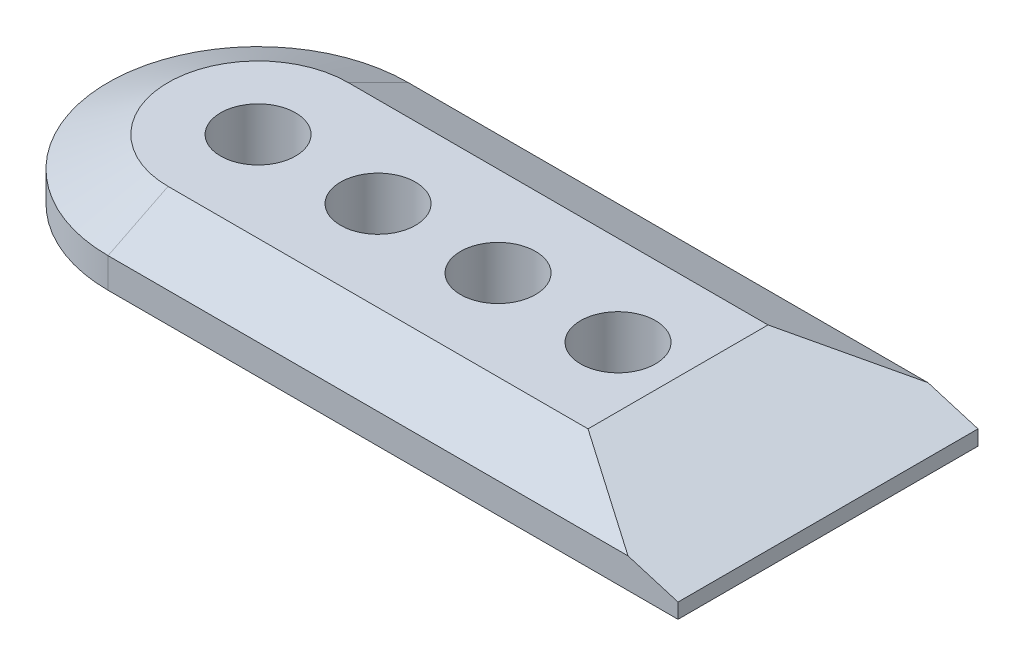
ISO-10303-21;
HEADER;
FILE_DESCRIPTION(('STEP AP214'),'2;1');
FILE_NAME('part.step','',(''),(''),'','','');
FILE_SCHEMA(('AUTOMOTIVE_DESIGN { 1 0 10303 214 1 1 1 1 }'));
ENDSEC;
DATA;
#1=APPLICATION_CONTEXT('core data for automotive mechanical design processes');
#2=APPLICATION_PROTOCOL_DEFINITION('international standard','automotive_design',2000,#1);
#3=PRODUCT_CONTEXT('',#1,'mechanical');
#4=PRODUCT('Part','Part','',(#3));
#5=PRODUCT_RELATED_PRODUCT_CATEGORY('part','',(#4));
#6=PRODUCT_DEFINITION_FORMATION('','',#4);
#7=PRODUCT_DEFINITION_CONTEXT('part definition',#1,'design');
#8=PRODUCT_DEFINITION('design','',#6,#7);
#9=PRODUCT_DEFINITION_SHAPE('','',#8);
#10=(LENGTH_UNIT() NAMED_UNIT(*) SI_UNIT(.MILLI.,.METRE.));
#11=(NAMED_UNIT(*) PLANE_ANGLE_UNIT() SI_UNIT($,.RADIAN.));
#12=(NAMED_UNIT(*) SI_UNIT($,.STERADIAN.) SOLID_ANGLE_UNIT());
#13=UNCERTAINTY_MEASURE_WITH_UNIT(LENGTH_MEASURE(1.E-05),#10,'distance_accuracy_value','');
#14=(GEOMETRIC_REPRESENTATION_CONTEXT(3) GLOBAL_UNCERTAINTY_ASSIGNED_CONTEXT((#13)) GLOBAL_UNIT_ASSIGNED_CONTEXT((#10,
#11,#12)) REPRESENTATION_CONTEXT('',''));
#15=CARTESIAN_POINT('',(0.,0.,0.));
#16=DIRECTION('',(0.,0.,1.));
#17=DIRECTION('',(1.,0.,0.));
#18=AXIS2_PLACEMENT_3D('',#15,#16,#17);
#19=CARTESIAN_POINT('',(0.,12.7,0.));
#20=DIRECTION('',(0.,-1.,0.));
#21=DIRECTION('',(0.,0.,-1.));
#22=AXIS2_PLACEMENT_3D('',#19,#20,#21);
#23=CYLINDRICAL_SURFACE('',#22,31.7500000000001);
#24=DIRECTION('',(0.,-1.,0.));
#25=VECTOR('',#24,1.);
#26=CARTESIAN_POINT('',(4.34453754557068E-06,12.7,31.75));
#27=LINE('',#26,#25);
#28=CARTESIAN_POINT('',(4.34453754557068E-06,6.34999999999999,31.75));
#29=VERTEX_POINT('',#28);
#30=CARTESIAN_POINT('',(4.34453754557068E-06,0.,31.75));
#31=VERTEX_POINT('',#30);
#32=EDGE_CURVE('E100',#29,#31,#27,.T.);
#33=ORIENTED_EDGE('',*,*,#32,.F.);
#34=CARTESIAN_POINT('',(0.,6.34999999999999,0.));
#35=DIRECTION('',(0.,-1.,0.));
#36=DIRECTION('',(0.,0.,-1.));
#37=AXIS2_PLACEMENT_3D('',#34,#35,#36);
#38=CIRCLE('',#37,31.7500000000001);
#39=CARTESIAN_POINT('',(0.,6.34999999999999,-31.75));
#40=VERTEX_POINT('',#39);
#41=EDGE_CURVE('E161',#29,#40,#38,.T.);
#42=ORIENTED_EDGE('',*,*,#41,.T.);
#43=DIRECTION('',(0.,-1.,0.));
#44=VECTOR('',#43,1.);
#45=CARTESIAN_POINT('',(0.,12.7,-31.75));
#46=LINE('',#45,#44);
#47=CARTESIAN_POINT('',(0.,0.,-31.75));
#48=VERTEX_POINT('',#47);
#49=EDGE_CURVE('E123',#40,#48,#46,.T.);
#50=ORIENTED_EDGE('',*,*,#49,.T.);
#51=CARTESIAN_POINT('',(0.,0.,0.));
#52=DIRECTION('',(0.,1.,0.));
#53=DIRECTION('',(0.,0.,-1.));
#54=AXIS2_PLACEMENT_3D('',#51,#52,#53);
#55=CIRCLE('',#54,31.7500000000001);
#56=EDGE_CURVE('E117',#48,#31,#55,.T.);
#57=ORIENTED_EDGE('',*,*,#56,.T.);
#58=EDGE_LOOP('',(#33,#42,#50,#57));
#59=FACE_BOUND('',#58,.T.);
#60=ADVANCED_FACE('F41',(#59),#23,.T.);
#61=CARTESIAN_POINT('',(4.34453754557068E-06,12.7,31.75));
#62=DIRECTION('',(0.,0.,-1.));
#63=DIRECTION('',(-1.,0.,0.));
#64=AXIS2_PLACEMENT_3D('',#61,#62,#63);
#65=PLANE('',#64);
#66=DIRECTION('',(0.,-1.,0.));
#67=VECTOR('',#66,1.);
#68=CARTESIAN_POINT('',(120.650004344538,12.7,31.75));
#69=LINE('',#68,#67);
#70=CARTESIAN_POINT('',(120.650004344538,3.17499999999999,31.75));
#71=VERTEX_POINT('',#70);
#72=CARTESIAN_POINT('',(120.650004344538,0.,31.75));
#73=VERTEX_POINT('',#72);
#74=EDGE_CURVE('E111',#71,#73,#69,.T.);
#75=ORIENTED_EDGE('',*,*,#74,.F.);
#76=DIRECTION('',(0.957826285221152,-0.287347885566343,0.));
#77=VECTOR('',#76,1.);
#78=CARTESIAN_POINT('',(88.9000043445372,12.7,31.75));
#79=LINE('',#78,#77);
#80=CARTESIAN_POINT('',(110.066671011204,6.34999999999999,31.75));
#81=VERTEX_POINT('',#80);
#82=EDGE_CURVE('E51',#71,#81,#79,.F.);
#83=ORIENTED_EDGE('',*,*,#82,.T.);
#84=DIRECTION('',(-1.,0.,0.));
#85=VECTOR('',#84,1.);
#86=CARTESIAN_POINT('',(4.34453754557068E-06,6.34999999999999,31.75));
#87=LINE('',#86,#85);
#88=EDGE_CURVE('E105',#81,#29,#87,.T.);
#89=ORIENTED_EDGE('',*,*,#88,.T.);
#90=ORIENTED_EDGE('',*,*,#32,.T.);
#91=DIRECTION('',(1.,0.,0.));
#92=VECTOR('',#91,1.);
#93=CARTESIAN_POINT('',(4.34453754557068E-06,0.,31.75));
#94=LINE('',#93,#92);
#95=EDGE_CURVE('E103',#31,#73,#94,.T.);
#96=ORIENTED_EDGE('',*,*,#95,.T.);
#97=EDGE_LOOP('',(#75,#83,#89,#90,#96));
#98=FACE_BOUND('',#97,.T.);
#99=ADVANCED_FACE('F102',(#98),#65,.F.);
#100=CARTESIAN_POINT('',(120.650004344538,12.7,31.75));
#101=DIRECTION('',(-1.,0.,0.));
#102=DIRECTION('',(0.,0.,1.));
#103=AXIS2_PLACEMENT_3D('',#100,#101,#102);
#104=PLANE('',#103);
#105=DIRECTION('',(0.,-1.,0.));
#106=VECTOR('',#105,1.);
#107=CARTESIAN_POINT('',(120.650004344538,12.7,-31.75));
#108=LINE('',#107,#106);
#109=CARTESIAN_POINT('',(120.650004344538,3.17499999999999,-31.75));
#110=VERTEX_POINT('',#109);
#111=CARTESIAN_POINT('',(120.650004344538,0.,-31.75));
#112=VERTEX_POINT('',#111);
#113=EDGE_CURVE('E143',#110,#112,#108,.T.);
#114=ORIENTED_EDGE('',*,*,#113,.F.);
#115=DIRECTION('',(0.,0.,1.));
#116=VECTOR('',#115,1.);
#117=CARTESIAN_POINT('',(120.650004344538,3.17499999999999,31.75));
#118=LINE('',#117,#116);
#119=EDGE_CURVE('E65',#110,#71,#118,.T.);
#120=ORIENTED_EDGE('',*,*,#119,.T.);
#121=ORIENTED_EDGE('',*,*,#74,.T.);
#122=DIRECTION('',(0.,0.,-1.));
#123=VECTOR('',#122,1.);
#124=CARTESIAN_POINT('',(120.650004344538,0.,31.75));
#125=LINE('',#124,#123);
#126=EDGE_CURVE('E119',#73,#112,#125,.T.);
#127=ORIENTED_EDGE('',*,*,#126,.T.);
#128=EDGE_LOOP('',(#114,#120,#121,#127));
#129=FACE_BOUND('',#128,.T.);
#130=ADVANCED_FACE('F187',(#129),#104,.F.);
#131=CARTESIAN_POINT('',(120.650004344538,12.7,-31.75));
#132=DIRECTION('',(0.,0.,1.));
#133=DIRECTION('',(1.,0.,0.));
#134=AXIS2_PLACEMENT_3D('',#131,#132,#133);
#135=PLANE('',#134);
#136=DIRECTION('',(1.,0.,0.));
#137=VECTOR('',#136,1.);
#138=CARTESIAN_POINT('',(120.650004344538,6.34999999999999,-31.75));
#139=LINE('',#138,#137);
#140=CARTESIAN_POINT('',(110.066671011204,6.34999999999999,-31.75));
#141=VERTEX_POINT('',#140);
#142=EDGE_CURVE('E157',#40,#141,#139,.T.);
#143=ORIENTED_EDGE('',*,*,#142,.T.);
#144=DIRECTION('',(-0.957826285221152,0.287347885566343,0.));
#145=VECTOR('',#144,1.);
#146=CARTESIAN_POINT('',(88.9000043445372,12.7,-31.75));
#147=LINE('',#146,#145);
#148=EDGE_CURVE('E177',#141,#110,#147,.F.);
#149=ORIENTED_EDGE('',*,*,#148,.T.);
#150=ORIENTED_EDGE('',*,*,#113,.T.);
#151=DIRECTION('',(-1.,0.,0.));
#152=VECTOR('',#151,1.);
#153=CARTESIAN_POINT('',(120.650004344538,0.,-31.75));
#154=LINE('',#153,#152);
#155=EDGE_CURVE('E138',#112,#48,#154,.T.);
#156=ORIENTED_EDGE('',*,*,#155,.T.);
#157=ORIENTED_EDGE('',*,*,#49,.F.);
#158=EDGE_LOOP('',(#143,#149,#150,#156,#157));
#159=FACE_BOUND('',#158,.T.);
#160=ADVANCED_FACE('F184',(#159),#135,.F.);
#161=CARTESIAN_POINT('',(0.,12.7,0.));
#162=DIRECTION('',(0.,-1.,0.));
#163=DIRECTION('',(0.,0.,-1.));
#164=AXIS2_PLACEMENT_3D('',#161,#162,#163);
#165=PLANE('',#164);
#166=CARTESIAN_POINT('',(0.,12.7,0.));
#167=DIRECTION('',(0.,1.,0.));
#168=DIRECTION('',(0.,0.,1.));
#169=AXIS2_PLACEMENT_3D('',#166,#167,#168);
#170=CIRCLE('',#169,7.9375);
#171=CARTESIAN_POINT('',(0.,12.7,7.9375));
#172=VERTEX_POINT('',#171);
#173=EDGE_CURVE('E169',#172,#172,#170,.T.);
#174=ORIENTED_EDGE('',*,*,#173,.F.);
#175=EDGE_LOOP('',(#174));
#176=FACE_BOUND('',#175,.T.);
#177=CARTESIAN_POINT('',(25.4,12.7,0.));
#178=DIRECTION('',(0.,1.,0.));
#179=DIRECTION('',(0.,0.,1.));
#180=AXIS2_PLACEMENT_3D('',#177,#178,#179);
#181=CIRCLE('',#180,7.9375);
#182=CARTESIAN_POINT('',(25.4,12.7,7.9375));
#183=VERTEX_POINT('',#182);
#184=EDGE_CURVE('E252',#183,#183,#181,.T.);
#185=ORIENTED_EDGE('',*,*,#184,.F.);
#186=EDGE_LOOP('',(#185));
#187=FACE_BOUND('',#186,.T.);
#188=CARTESIAN_POINT('',(50.8,12.7,0.));
#189=DIRECTION('',(0.,1.,0.));
#190=DIRECTION('',(0.,0.,1.));
#191=AXIS2_PLACEMENT_3D('',#188,#189,#190);
#192=CIRCLE('',#191,7.9375);
#193=CARTESIAN_POINT('',(50.8,12.7,7.9375));
#194=VERTEX_POINT('',#193);
#195=EDGE_CURVE('E264',#194,#194,#192,.T.);
#196=ORIENTED_EDGE('',*,*,#195,.F.);
#197=EDGE_LOOP('',(#196));
#198=FACE_BOUND('',#197,.T.);
#199=CARTESIAN_POINT('',(76.2,12.7,0.));
#200=DIRECTION('',(0.,1.,0.));
#201=DIRECTION('',(0.,0.,1.));
#202=AXIS2_PLACEMENT_3D('',#199,#200,#201);
#203=CIRCLE('',#202,7.93749999999999);
#204=CARTESIAN_POINT('',(76.2,12.7,7.93749999999999));
#205=VERTEX_POINT('',#204);
#206=EDGE_CURVE('E271',#205,#205,#203,.T.);
#207=ORIENTED_EDGE('',*,*,#206,.F.);
#208=EDGE_LOOP('',(#207));
#209=FACE_BOUND('',#208,.T.);
#210=DIRECTION('',(1.,0.,0.));
#211=VECTOR('',#210,1.);
#212=CARTESIAN_POINT('',(0.,12.7,19.0499999999999));
#213=LINE('',#212,#211);
#214=CARTESIAN_POINT('',(2.6067225273424E-06,12.7,19.0499999999999));
#215=VERTEX_POINT('',#214);
#216=CARTESIAN_POINT('',(88.9000043445372,12.7,19.05));
#217=VERTEX_POINT('',#216);
#218=EDGE_CURVE('E110',#215,#217,#213,.T.);
#219=ORIENTED_EDGE('',*,*,#218,.T.);
#220=DIRECTION('',(0.,0.,-1.));
#221=VECTOR('',#220,1.);
#222=CARTESIAN_POINT('',(88.9000043445372,12.7,0.));
#223=LINE('',#222,#221);
#224=CARTESIAN_POINT('',(88.9000043445372,12.7,-19.05));
#225=VERTEX_POINT('',#224);
#226=EDGE_CURVE('E166',#217,#225,#223,.T.);
#227=ORIENTED_EDGE('',*,*,#226,.T.);
#228=DIRECTION('',(-1.,0.,0.));
#229=VECTOR('',#228,1.);
#230=CARTESIAN_POINT('',(0.,12.7,-19.05));
#231=LINE('',#230,#229);
#232=CARTESIAN_POINT('',(0.,12.7,-19.0500000000001));
#233=VERTEX_POINT('',#232);
#234=EDGE_CURVE('E154',#225,#233,#231,.T.);
#235=ORIENTED_EDGE('',*,*,#234,.T.);
#236=CARTESIAN_POINT('',(0.,12.7,0.));
#237=DIRECTION('',(0.,-1.,0.));
#238=DIRECTION('',(0.,0.,-1.));
#239=AXIS2_PLACEMENT_3D('',#236,#237,#238);
#240=CIRCLE('',#239,19.0500000000001);
#241=EDGE_CURVE('E151',#233,#215,#240,.F.);
#242=ORIENTED_EDGE('',*,*,#241,.T.);
#243=EDGE_LOOP('',(#219,#227,#235,#242));
#244=FACE_BOUND('',#243,.T.);
#245=ADVANCED_FACE('F194',(#176,#187,#198,#209,#244),#165,.F.);
#246=CARTESIAN_POINT('',(0.,0.,0.));
#247=DIRECTION('',(0.,-1.,0.));
#248=DIRECTION('',(0.,0.,-1.));
#249=AXIS2_PLACEMENT_3D('',#246,#247,#248);
#250=PLANE('',#249);
#251=CARTESIAN_POINT('',(0.,0.,0.));
#252=DIRECTION('',(0.,1.,0.));
#253=DIRECTION('',(0.,0.,1.));
#254=AXIS2_PLACEMENT_3D('',#251,#252,#253);
#255=CIRCLE('',#254,7.9375);
#256=CARTESIAN_POINT('',(0.,0.,7.9375));
#257=VERTEX_POINT('',#256);
#258=EDGE_CURVE('E250',#257,#257,#255,.T.);
#259=ORIENTED_EDGE('',*,*,#258,.T.);
#260=EDGE_LOOP('',(#259));
#261=FACE_BOUND('',#260,.T.);
#262=CARTESIAN_POINT('',(25.4,0.,0.));
#263=DIRECTION('',(0.,1.,0.));
#264=DIRECTION('',(0.,0.,1.));
#265=AXIS2_PLACEMENT_3D('',#262,#263,#264);
#266=CIRCLE('',#265,7.9375);
#267=CARTESIAN_POINT('',(25.4,0.,7.9375));
#268=VERTEX_POINT('',#267);
#269=EDGE_CURVE('E258',#268,#268,#266,.T.);
#270=ORIENTED_EDGE('',*,*,#269,.T.);
#271=EDGE_LOOP('',(#270));
#272=FACE_BOUND('',#271,.T.);
#273=CARTESIAN_POINT('',(50.8,0.,0.));
#274=DIRECTION('',(0.,1.,0.));
#275=DIRECTION('',(0.,0.,1.));
#276=AXIS2_PLACEMENT_3D('',#273,#274,#275);
#277=CIRCLE('',#276,7.9375);
#278=CARTESIAN_POINT('',(50.8,0.,7.9375));
#279=VERTEX_POINT('',#278);
#280=EDGE_CURVE('E268',#279,#279,#277,.T.);
#281=ORIENTED_EDGE('',*,*,#280,.T.);
#282=EDGE_LOOP('',(#281));
#283=FACE_BOUND('',#282,.T.);
#284=CARTESIAN_POINT('',(76.2,0.,0.));
#285=DIRECTION('',(0.,1.,0.));
#286=DIRECTION('',(0.,0.,1.));
#287=AXIS2_PLACEMENT_3D('',#284,#285,#286);
#288=CIRCLE('',#287,7.93749999999999);
#289=CARTESIAN_POINT('',(76.2,0.,7.93749999999999));
#290=VERTEX_POINT('',#289);
#291=EDGE_CURVE('E133',#290,#290,#288,.T.);
#292=ORIENTED_EDGE('',*,*,#291,.T.);
#293=EDGE_LOOP('',(#292));
#294=FACE_BOUND('',#293,.T.);
#295=ORIENTED_EDGE('',*,*,#56,.F.);
#296=ORIENTED_EDGE('',*,*,#155,.F.);
#297=ORIENTED_EDGE('',*,*,#126,.F.);
#298=ORIENTED_EDGE('',*,*,#95,.F.);
#299=EDGE_LOOP('',(#295,#296,#297,#298));
#300=FACE_BOUND('',#299,.T.);
#301=ADVANCED_FACE('F115',(#261,#272,#283,#294,#300),#250,.T.);
#302=CARTESIAN_POINT('',(0.,12.7,19.0499999999999));
#303=DIRECTION('',(0.,-0.894427190999916,-0.447213595499957));
#304=DIRECTION('',(1.,0.,0.));
#305=AXIS2_PLACEMENT_3D('',#302,#303,#304);
#306=PLANE('',#305);
#307=ORIENTED_EDGE('',*,*,#88,.F.);
#308=DIRECTION('',(-0.830454798537402,0.249136439561218,-0.498272879122437));
#309=VECTOR('',#308,1.);
#310=CARTESIAN_POINT('',(27.5896565207181,31.0931043471455,-17.7362086942912));
#311=LINE('',#310,#309);
#312=EDGE_CURVE('E11',#81,#217,#311,.T.);
#313=ORIENTED_EDGE('',*,*,#312,.T.);
#314=ORIENTED_EDGE('',*,*,#218,.F.);
#315=DIRECTION('',(-1.22389685451288E-07,0.447213595499954,-0.89442719099991));
#316=VECTOR('',#315,1.);
#317=CARTESIAN_POINT('',(4.34453754557066E-06,6.34999999999999,31.75));
#318=LINE('',#317,#316);
#319=EDGE_CURVE('E126',#29,#215,#318,.T.);
#320=ORIENTED_EDGE('',*,*,#319,.F.);
#321=EDGE_LOOP('',(#307,#313,#314,#320));
#322=FACE_BOUND('',#321,.T.);
#323=ADVANCED_FACE('F192',(#322),#306,.F.);
#324=CARTESIAN_POINT('',(0.,12.7,0.));
#325=DIRECTION('',(0.,-1.,0.));
#326=DIRECTION('',(0.,0.,-1.));
#327=AXIS2_PLACEMENT_3D('',#324,#325,#326);
#328=CONICAL_SURFACE('',#327,19.0500000000001,1.10714871779409);
#329=ORIENTED_EDGE('',*,*,#319,.T.);
#330=ORIENTED_EDGE('',*,*,#241,.F.);
#331=DIRECTION('',(0.,0.447213595499957,0.894427190999916));
#332=VECTOR('',#331,1.);
#333=CARTESIAN_POINT('',(0.,6.34999999999999,-31.7500000000001));
#334=LINE('',#333,#332);
#335=EDGE_CURVE('E130',#40,#233,#334,.T.);
#336=ORIENTED_EDGE('',*,*,#335,.F.);
#337=ORIENTED_EDGE('',*,*,#41,.F.);
#338=EDGE_LOOP('',(#329,#330,#336,#337));
#339=FACE_BOUND('',#338,.T.);
#340=ADVANCED_FACE('F199',(#339),#328,.T.);
#341=CARTESIAN_POINT('',(0.,12.7,-19.05));
#342=DIRECTION('',(0.,-0.894427190999916,0.447213595499957));
#343=DIRECTION('',(-1.,0.,0.));
#344=AXIS2_PLACEMENT_3D('',#341,#342,#343);
#345=PLANE('',#344);
#346=ORIENTED_EDGE('',*,*,#234,.F.);
#347=DIRECTION('',(0.830454798537402,-0.249136439561218,-0.498272879122437));
#348=VECTOR('',#347,1.);
#349=CARTESIAN_POINT('',(27.5896565207181,31.0931043471455,17.7362086942912));
#350=LINE('',#349,#348);
#351=EDGE_CURVE('E174',#225,#141,#350,.T.);
#352=ORIENTED_EDGE('',*,*,#351,.T.);
#353=ORIENTED_EDGE('',*,*,#142,.F.);
#354=ORIENTED_EDGE('',*,*,#335,.T.);
#355=EDGE_LOOP('',(#346,#352,#353,#354));
#356=FACE_BOUND('',#355,.T.);
#357=ADVANCED_FACE('F202',(#356),#345,.F.);
#358=CARTESIAN_POINT('',(88.9000043445372,12.7,0.));
#359=DIRECTION('',(-0.287347885566343,-0.957826285221152,0.));
#360=DIRECTION('',(0.,0.,-1.));
#361=AXIS2_PLACEMENT_3D('',#358,#359,#360);
#362=PLANE('',#361);
#363=ORIENTED_EDGE('',*,*,#82,.F.);
#364=ORIENTED_EDGE('',*,*,#119,.F.);
#365=ORIENTED_EDGE('',*,*,#148,.F.);
#366=ORIENTED_EDGE('',*,*,#351,.F.);
#367=ORIENTED_EDGE('',*,*,#226,.F.);
#368=ORIENTED_EDGE('',*,*,#312,.F.);
#369=EDGE_LOOP('',(#363,#364,#365,#366,#367,#368));
#370=FACE_BOUND('',#369,.T.);
#371=ADVANCED_FACE('F44',(#370),#362,.F.);
#372=CARTESIAN_POINT('',(76.2,12.7,0.));
#373=DIRECTION('',(0.,-1.,0.));
#374=DIRECTION('',(0.,0.,-1.));
#375=AXIS2_PLACEMENT_3D('',#372,#373,#374);
#376=CYLINDRICAL_SURFACE('',#375,7.93749999999999);
#377=ORIENTED_EDGE('',*,*,#206,.T.);
#378=EDGE_LOOP('',(#377));
#379=FACE_BOUND('',#378,.T.);
#380=ORIENTED_EDGE('',*,*,#291,.F.);
#381=EDGE_LOOP('',(#380));
#382=FACE_BOUND('',#381,.T.);
#383=ADVANCED_FACE('F209',(#379,#382),#376,.F.);
#384=CARTESIAN_POINT('',(50.8,12.7,0.));
#385=DIRECTION('',(0.,-1.,0.));
#386=DIRECTION('',(0.,0.,-1.));
#387=AXIS2_PLACEMENT_3D('',#384,#385,#386);
#388=CYLINDRICAL_SURFACE('',#387,7.9375);
#389=ORIENTED_EDGE('',*,*,#195,.T.);
#390=EDGE_LOOP('',(#389));
#391=FACE_BOUND('',#390,.T.);
#392=ORIENTED_EDGE('',*,*,#280,.F.);
#393=EDGE_LOOP('',(#392));
#394=FACE_BOUND('',#393,.T.);
#395=ADVANCED_FACE('F231',(#391,#394),#388,.F.);
#396=CARTESIAN_POINT('',(25.4,12.7,0.));
#397=DIRECTION('',(0.,-1.,0.));
#398=DIRECTION('',(0.,0.,-1.));
#399=AXIS2_PLACEMENT_3D('',#396,#397,#398);
#400=CYLINDRICAL_SURFACE('',#399,7.9375);
#401=ORIENTED_EDGE('',*,*,#184,.T.);
#402=EDGE_LOOP('',(#401));
#403=FACE_BOUND('',#402,.T.);
#404=ORIENTED_EDGE('',*,*,#269,.F.);
#405=EDGE_LOOP('',(#404));
#406=FACE_BOUND('',#405,.T.);
#407=ADVANCED_FACE('F235',(#403,#406),#400,.F.);
#408=CARTESIAN_POINT('',(0.,12.7,0.));
#409=DIRECTION('',(0.,-1.,0.));
#410=DIRECTION('',(0.,0.,-1.));
#411=AXIS2_PLACEMENT_3D('',#408,#409,#410);
#412=CYLINDRICAL_SURFACE('',#411,7.9375);
#413=ORIENTED_EDGE('',*,*,#173,.T.);
#414=EDGE_LOOP('',(#413));
#415=FACE_BOUND('',#414,.T.);
#416=ORIENTED_EDGE('',*,*,#258,.F.);
#417=EDGE_LOOP('',(#416));
#418=FACE_BOUND('',#417,.T.);
#419=ADVANCED_FACE('F239',(#415,#418),#412,.F.);
#420=CLOSED_SHELL('',(#60,#99,#130,#160,#245,#301,#323,#340,#357,#371,#383,#395,#407,#419));
#421=MANIFOLD_SOLID_BREP('B2',#420);
#422=ADVANCED_BREP_SHAPE_REPRESENTATION('',(#18,#421),#14);
#423=SHAPE_DEFINITION_REPRESENTATION(#9,#422);
ENDSEC;
END-ISO-10303-21;
